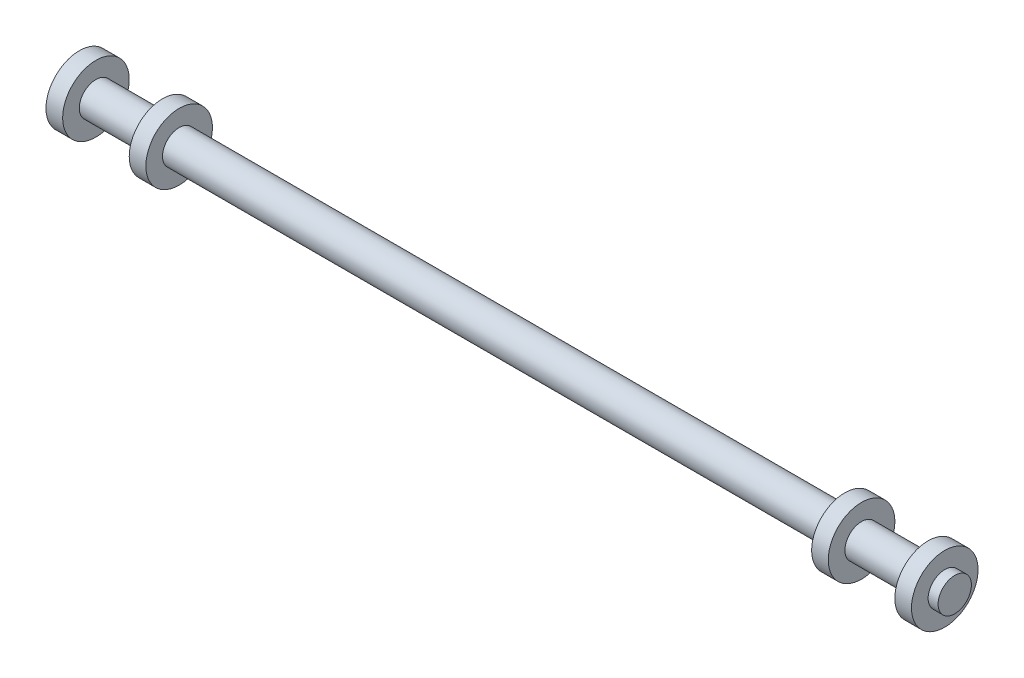
ISO-10303-21;
HEADER;
FILE_DESCRIPTION(('STEP AP214'),'2;1');
FILE_NAME('part.step','',(''),(''),'','','');
FILE_SCHEMA(('AUTOMOTIVE_DESIGN { 1 0 10303 214 1 1 1 1 }'));
ENDSEC;
DATA;
#1=APPLICATION_CONTEXT('core data for automotive mechanical design processes');
#2=APPLICATION_PROTOCOL_DEFINITION('international standard','automotive_design',2000,#1);
#3=PRODUCT_CONTEXT('',#1,'mechanical');
#4=PRODUCT('Part','Part','',(#3));
#5=PRODUCT_RELATED_PRODUCT_CATEGORY('part','',(#4));
#6=PRODUCT_DEFINITION_FORMATION('','',#4);
#7=PRODUCT_DEFINITION_CONTEXT('part definition',#1,'design');
#8=PRODUCT_DEFINITION('design','',#6,#7);
#9=PRODUCT_DEFINITION_SHAPE('','',#8);
#10=(LENGTH_UNIT() NAMED_UNIT(*) SI_UNIT(.MILLI.,.METRE.));
#11=(NAMED_UNIT(*) PLANE_ANGLE_UNIT() SI_UNIT($,.RADIAN.));
#12=(NAMED_UNIT(*) SI_UNIT($,.STERADIAN.) SOLID_ANGLE_UNIT());
#13=UNCERTAINTY_MEASURE_WITH_UNIT(LENGTH_MEASURE(1.E-05),#10,'distance_accuracy_value','');
#14=(GEOMETRIC_REPRESENTATION_CONTEXT(3) GLOBAL_UNCERTAINTY_ASSIGNED_CONTEXT((#13)) GLOBAL_UNIT_ASSIGNED_CONTEXT((#10,
#11,#12)) REPRESENTATION_CONTEXT('',''));
#15=CARTESIAN_POINT('',(0.,0.,0.));
#16=DIRECTION('',(0.,0.,1.));
#17=DIRECTION('',(1.,0.,0.));
#18=AXIS2_PLACEMENT_3D('',#15,#16,#17);
#19=CARTESIAN_POINT('',(-66.5,0.,0.));
#20=DIRECTION('',(-1.,0.,0.));
#21=DIRECTION('',(0.,0.,1.));
#22=AXIS2_PLACEMENT_3D('',#19,#20,#21);
#23=CYLINDRICAL_SURFACE('',#22,5.00000000000001);
#24=CARTESIAN_POINT('',(-52.5,0.,0.));
#25=DIRECTION('',(-1.,0.,0.));
#26=DIRECTION('',(0.,0.,1.));
#27=AXIS2_PLACEMENT_3D('',#24,#25,#26);
#28=CIRCLE('',#27,5.00000000000001);
#29=CARTESIAN_POINT('',(-52.5,0.,5.00000000000001));
#30=VERTEX_POINT('',#29);
#31=EDGE_CURVE('E10',#30,#30,#28,.T.);
#32=ORIENTED_EDGE('',*,*,#31,.F.);
#33=EDGE_LOOP('',(#32));
#34=FACE_BOUND('',#33,.T.);
#35=CARTESIAN_POINT('',(-50.,0.,0.));
#36=DIRECTION('',(-1.,0.,0.));
#37=DIRECTION('',(0.,0.,1.));
#38=AXIS2_PLACEMENT_3D('',#35,#36,#37);
#39=CIRCLE('',#38,5.00000000000001);
#40=CARTESIAN_POINT('',(-50.,0.,5.00000000000001));
#41=VERTEX_POINT('',#40);
#42=EDGE_CURVE('E89',#41,#41,#39,.T.);
#43=ORIENTED_EDGE('',*,*,#42,.T.);
#44=EDGE_LOOP('',(#43));
#45=FACE_BOUND('',#44,.T.);
#46=ADVANCED_FACE('F31',(#34,#45),#23,.T.);
#47=CARTESIAN_POINT('',(-52.5,5.00000000000001,0.));
#48=DIRECTION('',(1.,0.,0.));
#49=DIRECTION('',(0.,0.,-1.));
#50=AXIS2_PLACEMENT_3D('',#47,#48,#49);
#51=PLANE('',#50);
#52=CARTESIAN_POINT('',(-52.5,0.,0.));
#53=DIRECTION('',(-1.,0.,0.));
#54=DIRECTION('',(0.,0.,1.));
#55=AXIS2_PLACEMENT_3D('',#52,#53,#54);
#56=CIRCLE('',#55,2.50000000000001);
#57=CARTESIAN_POINT('',(-52.5,0.,2.50000000000001));
#58=VERTEX_POINT('',#57);
#59=EDGE_CURVE('E37',#58,#58,#56,.T.);
#60=ORIENTED_EDGE('',*,*,#59,.F.);
#61=EDGE_LOOP('',(#60));
#62=FACE_BOUND('',#61,.T.);
#63=ORIENTED_EDGE('',*,*,#31,.T.);
#64=EDGE_LOOP('',(#63));
#65=FACE_BOUND('',#64,.T.);
#66=ADVANCED_FACE('F165',(#62,#65),#51,.F.);
#67=CARTESIAN_POINT('',(-66.5,0.,0.));
#68=DIRECTION('',(-1.,0.,0.));
#69=DIRECTION('',(0.,0.,1.));
#70=AXIS2_PLACEMENT_3D('',#67,#68,#69);
#71=CYLINDRICAL_SURFACE('',#70,2.5);
#72=CARTESIAN_POINT('',(-62.5,0.,0.));
#73=DIRECTION('',(-1.,0.,0.));
#74=DIRECTION('',(0.,0.,1.));
#75=AXIS2_PLACEMENT_3D('',#72,#73,#74);
#76=CIRCLE('',#75,2.5);
#77=CARTESIAN_POINT('',(-62.5,0.,2.5));
#78=VERTEX_POINT('',#77);
#79=EDGE_CURVE('E41',#78,#78,#76,.T.);
#80=ORIENTED_EDGE('',*,*,#79,.F.);
#81=EDGE_LOOP('',(#80));
#82=FACE_BOUND('',#81,.T.);
#83=ORIENTED_EDGE('',*,*,#59,.T.);
#84=EDGE_LOOP('',(#83));
#85=FACE_BOUND('',#84,.T.);
#86=ADVANCED_FACE('F170',(#82,#85),#71,.T.);
#87=CARTESIAN_POINT('',(-62.5,2.5,0.));
#88=DIRECTION('',(-1.,0.,0.));
#89=DIRECTION('',(0.,0.,1.));
#90=AXIS2_PLACEMENT_3D('',#87,#88,#89);
#91=PLANE('',#90);
#92=CARTESIAN_POINT('',(-62.5,0.,0.));
#93=DIRECTION('',(-1.,0.,0.));
#94=DIRECTION('',(0.,0.,1.));
#95=AXIS2_PLACEMENT_3D('',#92,#93,#94);
#96=CIRCLE('',#95,5.);
#97=CARTESIAN_POINT('',(-62.5,0.,5.));
#98=VERTEX_POINT('',#97);
#99=EDGE_CURVE('E45',#98,#98,#96,.T.);
#100=ORIENTED_EDGE('',*,*,#99,.F.);
#101=EDGE_LOOP('',(#100));
#102=FACE_BOUND('',#101,.T.);
#103=ORIENTED_EDGE('',*,*,#79,.T.);
#104=EDGE_LOOP('',(#103));
#105=FACE_BOUND('',#104,.T.);
#106=ADVANCED_FACE('F175',(#102,#105),#91,.F.);
#107=CARTESIAN_POINT('',(-66.5,0.,0.));
#108=DIRECTION('',(-1.,0.,0.));
#109=DIRECTION('',(0.,0.,1.));
#110=AXIS2_PLACEMENT_3D('',#107,#108,#109);
#111=CYLINDRICAL_SURFACE('',#110,5.);
#112=CARTESIAN_POINT('',(-65.,0.,0.));
#113=DIRECTION('',(-1.,0.,0.));
#114=DIRECTION('',(0.,0.,1.));
#115=AXIS2_PLACEMENT_3D('',#112,#113,#114);
#116=CIRCLE('',#115,5.);
#117=CARTESIAN_POINT('',(-65.,0.,5.));
#118=VERTEX_POINT('',#117);
#119=EDGE_CURVE('E50',#118,#118,#116,.T.);
#120=ORIENTED_EDGE('',*,*,#119,.F.);
#121=EDGE_LOOP('',(#120));
#122=FACE_BOUND('',#121,.T.);
#123=ORIENTED_EDGE('',*,*,#99,.T.);
#124=EDGE_LOOP('',(#123));
#125=FACE_BOUND('',#124,.T.);
#126=ADVANCED_FACE('F181',(#122,#125),#111,.T.);
#127=CARTESIAN_POINT('',(-65.,5.,0.));
#128=DIRECTION('',(1.,0.,0.));
#129=DIRECTION('',(0.,0.,-1.));
#130=AXIS2_PLACEMENT_3D('',#127,#128,#129);
#131=PLANE('',#130);
#132=CARTESIAN_POINT('',(-65.,0.,0.));
#133=DIRECTION('',(-1.,0.,0.));
#134=DIRECTION('',(0.,0.,1.));
#135=AXIS2_PLACEMENT_3D('',#132,#133,#134);
#136=CIRCLE('',#135,2.5);
#137=CARTESIAN_POINT('',(-65.,0.,2.5));
#138=VERTEX_POINT('',#137);
#139=EDGE_CURVE('E53',#138,#138,#136,.T.);
#140=ORIENTED_EDGE('',*,*,#139,.F.);
#141=EDGE_LOOP('',(#140));
#142=FACE_BOUND('',#141,.T.);
#143=ORIENTED_EDGE('',*,*,#119,.T.);
#144=EDGE_LOOP('',(#143));
#145=FACE_BOUND('',#144,.T.);
#146=ADVANCED_FACE('F185',(#142,#145),#131,.F.);
#147=CARTESIAN_POINT('',(-66.5,0.,0.));
#148=DIRECTION('',(-1.,0.,0.));
#149=DIRECTION('',(0.,0.,1.));
#150=AXIS2_PLACEMENT_3D('',#147,#148,#149);
#151=CYLINDRICAL_SURFACE('',#150,2.5);
#152=CARTESIAN_POINT('',(-66.5,0.,0.));
#153=DIRECTION('',(-1.,0.,0.));
#154=DIRECTION('',(0.,0.,1.));
#155=AXIS2_PLACEMENT_3D('',#152,#153,#154);
#156=CIRCLE('',#155,2.5);
#157=CARTESIAN_POINT('',(-66.5,0.,2.5));
#158=VERTEX_POINT('',#157);
#159=EDGE_CURVE('E56',#158,#158,#156,.T.);
#160=ORIENTED_EDGE('',*,*,#159,.F.);
#161=EDGE_LOOP('',(#160));
#162=FACE_BOUND('',#161,.T.);
#163=ORIENTED_EDGE('',*,*,#139,.T.);
#164=EDGE_LOOP('',(#163));
#165=FACE_BOUND('',#164,.T.);
#166=ADVANCED_FACE('F161',(#162,#165),#151,.T.);
#167=CARTESIAN_POINT('',(-66.5,2.5,0.));
#168=DIRECTION('',(1.,0.,0.));
#169=DIRECTION('',(0.,0.,-1.));
#170=AXIS2_PLACEMENT_3D('',#167,#168,#169);
#171=PLANE('',#170);
#172=ORIENTED_EDGE('',*,*,#159,.T.);
#173=EDGE_LOOP('',(#172));
#174=FACE_BOUND('',#173,.T.);
#175=ADVANCED_FACE('F156',(#174),#171,.F.);
#176=CARTESIAN_POINT('',(66.5,2.5,0.));
#177=DIRECTION('',(-1.,0.,0.));
#178=DIRECTION('',(0.,0.,1.));
#179=AXIS2_PLACEMENT_3D('',#176,#177,#178);
#180=PLANE('',#179);
#181=CARTESIAN_POINT('',(66.5,0.,0.));
#182=DIRECTION('',(-1.,0.,0.));
#183=DIRECTION('',(0.,0.,1.));
#184=AXIS2_PLACEMENT_3D('',#181,#182,#183);
#185=CIRCLE('',#184,2.5);
#186=CARTESIAN_POINT('',(66.5,0.,2.5));
#187=VERTEX_POINT('',#186);
#188=EDGE_CURVE('E59',#187,#187,#185,.T.);
#189=ORIENTED_EDGE('',*,*,#188,.F.);
#190=EDGE_LOOP('',(#189));
#191=FACE_BOUND('',#190,.T.);
#192=ADVANCED_FACE('F151',(#191),#180,.F.);
#193=CARTESIAN_POINT('',(-66.5,0.,0.));
#194=DIRECTION('',(-1.,0.,0.));
#195=DIRECTION('',(0.,0.,1.));
#196=AXIS2_PLACEMENT_3D('',#193,#194,#195);
#197=CYLINDRICAL_SURFACE('',#196,2.5);
#198=CARTESIAN_POINT('',(65.,0.,0.));
#199=DIRECTION('',(-1.,0.,0.));
#200=DIRECTION('',(0.,0.,1.));
#201=AXIS2_PLACEMENT_3D('',#198,#199,#200);
#202=CIRCLE('',#201,2.5);
#203=CARTESIAN_POINT('',(65.,0.,2.5));
#204=VERTEX_POINT('',#203);
#205=EDGE_CURVE('E62',#204,#204,#202,.T.);
#206=ORIENTED_EDGE('',*,*,#205,.F.);
#207=EDGE_LOOP('',(#206));
#208=FACE_BOUND('',#207,.T.);
#209=ORIENTED_EDGE('',*,*,#188,.T.);
#210=EDGE_LOOP('',(#209));
#211=FACE_BOUND('',#210,.T.);
#212=ADVANCED_FACE('F145',(#208,#211),#197,.T.);
#213=CARTESIAN_POINT('',(65.,5.,0.));
#214=DIRECTION('',(-1.,0.,0.));
#215=DIRECTION('',(0.,0.,1.));
#216=AXIS2_PLACEMENT_3D('',#213,#214,#215);
#217=PLANE('',#216);
#218=CARTESIAN_POINT('',(65.,0.,0.));
#219=DIRECTION('',(-1.,0.,0.));
#220=DIRECTION('',(0.,0.,1.));
#221=AXIS2_PLACEMENT_3D('',#218,#219,#220);
#222=CIRCLE('',#221,5.);
#223=CARTESIAN_POINT('',(65.,0.,5.));
#224=VERTEX_POINT('',#223);
#225=EDGE_CURVE('E65',#224,#224,#222,.T.);
#226=ORIENTED_EDGE('',*,*,#225,.F.);
#227=EDGE_LOOP('',(#226));
#228=FACE_BOUND('',#227,.T.);
#229=ORIENTED_EDGE('',*,*,#205,.T.);
#230=EDGE_LOOP('',(#229));
#231=FACE_BOUND('',#230,.T.);
#232=ADVANCED_FACE('F139',(#228,#231),#217,.F.);
#233=CARTESIAN_POINT('',(-66.5,0.,0.));
#234=DIRECTION('',(-1.,0.,0.));
#235=DIRECTION('',(0.,0.,1.));
#236=AXIS2_PLACEMENT_3D('',#233,#234,#235);
#237=CYLINDRICAL_SURFACE('',#236,5.);
#238=CARTESIAN_POINT('',(62.5,0.,0.));
#239=DIRECTION('',(-1.,0.,0.));
#240=DIRECTION('',(0.,0.,1.));
#241=AXIS2_PLACEMENT_3D('',#238,#239,#240);
#242=CIRCLE('',#241,5.);
#243=CARTESIAN_POINT('',(62.5,0.,5.));
#244=VERTEX_POINT('',#243);
#245=EDGE_CURVE('E68',#244,#244,#242,.T.);
#246=ORIENTED_EDGE('',*,*,#245,.F.);
#247=EDGE_LOOP('',(#246));
#248=FACE_BOUND('',#247,.T.);
#249=ORIENTED_EDGE('',*,*,#225,.T.);
#250=EDGE_LOOP('',(#249));
#251=FACE_BOUND('',#250,.T.);
#252=ADVANCED_FACE('F133',(#248,#251),#237,.T.);
#253=CARTESIAN_POINT('',(62.5,2.5,0.));
#254=DIRECTION('',(1.,0.,0.));
#255=DIRECTION('',(0.,0.,-1.));
#256=AXIS2_PLACEMENT_3D('',#253,#254,#255);
#257=PLANE('',#256);
#258=CARTESIAN_POINT('',(62.5,0.,0.));
#259=DIRECTION('',(-1.,0.,0.));
#260=DIRECTION('',(0.,0.,1.));
#261=AXIS2_PLACEMENT_3D('',#258,#259,#260);
#262=CIRCLE('',#261,2.5);
#263=CARTESIAN_POINT('',(62.5,0.,2.5));
#264=VERTEX_POINT('',#263);
#265=EDGE_CURVE('E71',#264,#264,#262,.T.);
#266=ORIENTED_EDGE('',*,*,#265,.F.);
#267=EDGE_LOOP('',(#266));
#268=FACE_BOUND('',#267,.T.);
#269=ORIENTED_EDGE('',*,*,#245,.T.);
#270=EDGE_LOOP('',(#269));
#271=FACE_BOUND('',#270,.T.);
#272=ADVANCED_FACE('F127',(#268,#271),#257,.F.);
#273=CARTESIAN_POINT('',(-66.5,0.,0.));
#274=DIRECTION('',(-1.,0.,0.));
#275=DIRECTION('',(0.,0.,1.));
#276=AXIS2_PLACEMENT_3D('',#273,#274,#275);
#277=CYLINDRICAL_SURFACE('',#276,2.5);
#278=CARTESIAN_POINT('',(52.5,0.,0.));
#279=DIRECTION('',(-1.,0.,0.));
#280=DIRECTION('',(0.,0.,1.));
#281=AXIS2_PLACEMENT_3D('',#278,#279,#280);
#282=CIRCLE('',#281,2.50000000000001);
#283=CARTESIAN_POINT('',(52.5,0.,2.50000000000001));
#284=VERTEX_POINT('',#283);
#285=EDGE_CURVE('E74',#284,#284,#282,.T.);
#286=ORIENTED_EDGE('',*,*,#285,.F.);
#287=EDGE_LOOP('',(#286));
#288=FACE_BOUND('',#287,.T.);
#289=ORIENTED_EDGE('',*,*,#265,.T.);
#290=EDGE_LOOP('',(#289));
#291=FACE_BOUND('',#290,.T.);
#292=ADVANCED_FACE('F121',(#288,#291),#277,.T.);
#293=CARTESIAN_POINT('',(52.5,5.00000000000001,0.));
#294=DIRECTION('',(-1.,0.,0.));
#295=DIRECTION('',(0.,0.,1.));
#296=AXIS2_PLACEMENT_3D('',#293,#294,#295);
#297=PLANE('',#296);
#298=CARTESIAN_POINT('',(52.5,0.,0.));
#299=DIRECTION('',(-1.,0.,0.));
#300=DIRECTION('',(0.,0.,1.));
#301=AXIS2_PLACEMENT_3D('',#298,#299,#300);
#302=CIRCLE('',#301,5.00000000000001);
#303=CARTESIAN_POINT('',(52.5,0.,5.00000000000001));
#304=VERTEX_POINT('',#303);
#305=EDGE_CURVE('E77',#304,#304,#302,.T.);
#306=ORIENTED_EDGE('',*,*,#305,.F.);
#307=EDGE_LOOP('',(#306));
#308=FACE_BOUND('',#307,.T.);
#309=ORIENTED_EDGE('',*,*,#285,.T.);
#310=EDGE_LOOP('',(#309));
#311=FACE_BOUND('',#310,.T.);
#312=ADVANCED_FACE('F115',(#308,#311),#297,.F.);
#313=CARTESIAN_POINT('',(-66.5,0.,0.));
#314=DIRECTION('',(-1.,0.,0.));
#315=DIRECTION('',(0.,0.,1.));
#316=AXIS2_PLACEMENT_3D('',#313,#314,#315);
#317=CYLINDRICAL_SURFACE('',#316,5.00000000000001);
#318=CARTESIAN_POINT('',(50.,0.,0.));
#319=DIRECTION('',(-1.,0.,0.));
#320=DIRECTION('',(0.,0.,1.));
#321=AXIS2_PLACEMENT_3D('',#318,#319,#320);
#322=CIRCLE('',#321,5.00000000000001);
#323=CARTESIAN_POINT('',(50.,0.,5.00000000000001));
#324=VERTEX_POINT('',#323);
#325=EDGE_CURVE('E80',#324,#324,#322,.T.);
#326=ORIENTED_EDGE('',*,*,#325,.F.);
#327=EDGE_LOOP('',(#326));
#328=FACE_BOUND('',#327,.T.);
#329=ORIENTED_EDGE('',*,*,#305,.T.);
#330=EDGE_LOOP('',(#329));
#331=FACE_BOUND('',#330,.T.);
#332=ADVANCED_FACE('F109',(#328,#331),#317,.T.);
#333=CARTESIAN_POINT('',(50.,2.50000000000001,0.));
#334=DIRECTION('',(1.,0.,0.));
#335=DIRECTION('',(0.,0.,-1.));
#336=AXIS2_PLACEMENT_3D('',#333,#334,#335);
#337=PLANE('',#336);
#338=CARTESIAN_POINT('',(50.,0.,0.));
#339=DIRECTION('',(-1.,0.,0.));
#340=DIRECTION('',(0.,0.,1.));
#341=AXIS2_PLACEMENT_3D('',#338,#339,#340);
#342=CIRCLE('',#341,2.50000000000001);
#343=CARTESIAN_POINT('',(50.,0.,2.50000000000001));
#344=VERTEX_POINT('',#343);
#345=EDGE_CURVE('E83',#344,#344,#342,.T.);
#346=ORIENTED_EDGE('',*,*,#345,.F.);
#347=EDGE_LOOP('',(#346));
#348=FACE_BOUND('',#347,.T.);
#349=ORIENTED_EDGE('',*,*,#325,.T.);
#350=EDGE_LOOP('',(#349));
#351=FACE_BOUND('',#350,.T.);
#352=ADVANCED_FACE('F103',(#348,#351),#337,.F.);
#353=CARTESIAN_POINT('',(-66.5,0.,0.));
#354=DIRECTION('',(-1.,0.,0.));
#355=DIRECTION('',(0.,0.,1.));
#356=AXIS2_PLACEMENT_3D('',#353,#354,#355);
#357=CYLINDRICAL_SURFACE('',#356,2.50000000000001);
#358=CARTESIAN_POINT('',(-50.,0.,0.));
#359=DIRECTION('',(-1.,0.,0.));
#360=DIRECTION('',(0.,0.,1.));
#361=AXIS2_PLACEMENT_3D('',#358,#359,#360);
#362=CIRCLE('',#361,2.50000000000001);
#363=CARTESIAN_POINT('',(-50.,0.,2.50000000000001));
#364=VERTEX_POINT('',#363);
#365=EDGE_CURVE('E86',#364,#364,#362,.T.);
#366=ORIENTED_EDGE('',*,*,#365,.F.);
#367=EDGE_LOOP('',(#366));
#368=FACE_BOUND('',#367,.T.);
#369=ORIENTED_EDGE('',*,*,#345,.T.);
#370=EDGE_LOOP('',(#369));
#371=FACE_BOUND('',#370,.T.);
#372=ADVANCED_FACE('F97',(#368,#371),#357,.T.);
#373=CARTESIAN_POINT('',(-50.,2.50000000000001,0.));
#374=DIRECTION('',(-1.,0.,0.));
#375=DIRECTION('',(0.,0.,1.));
#376=AXIS2_PLACEMENT_3D('',#373,#374,#375);
#377=PLANE('',#376);
#378=ORIENTED_EDGE('',*,*,#42,.F.);
#379=EDGE_LOOP('',(#378));
#380=FACE_BOUND('',#379,.T.);
#381=ORIENTED_EDGE('',*,*,#365,.T.);
#382=EDGE_LOOP('',(#381));
#383=FACE_BOUND('',#382,.T.);
#384=ADVANCED_FACE('F94',(#380,#383),#377,.F.);
#385=CLOSED_SHELL('',(#46,#66,#86,#106,#126,#146,#166,#175,#192,#212,#232,#252,#272,#292,#312,
#332,#352,#372,#384));
#386=MANIFOLD_SOLID_BREP('B2',#385);
#387=ADVANCED_BREP_SHAPE_REPRESENTATION('',(#18,#386),#14);
#388=SHAPE_DEFINITION_REPRESENTATION(#9,#387);
ENDSEC;
END-ISO-10303-21;
